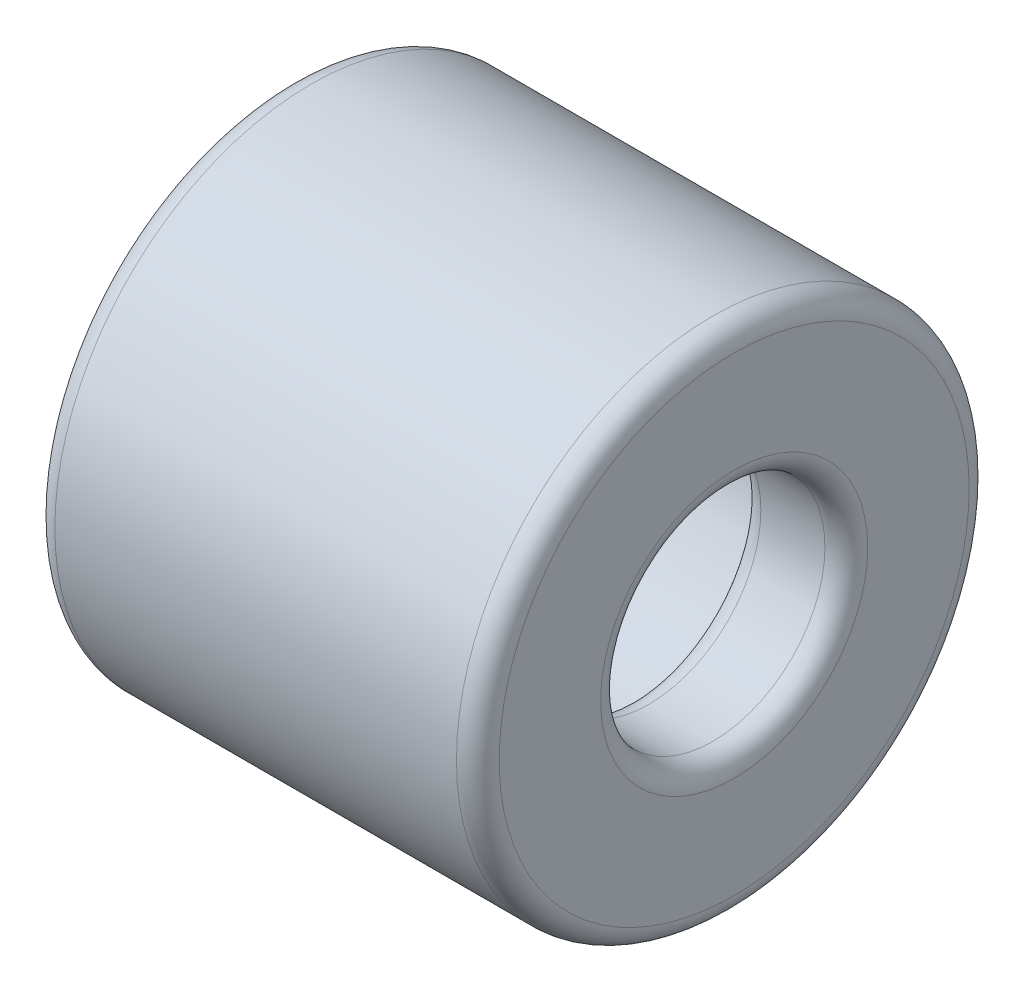
ISO-10303-21;
HEADER;
FILE_DESCRIPTION(('STEP AP214'),'2;1');
FILE_NAME('part.step','',(''),(''),'','','');
FILE_SCHEMA(('AUTOMOTIVE_DESIGN { 1 0 10303 214 1 1 1 1 }'));
ENDSEC;
DATA;
#1=APPLICATION_CONTEXT('core data for automotive mechanical design processes');
#2=APPLICATION_PROTOCOL_DEFINITION('international standard','automotive_design',2000,#1);
#3=PRODUCT_CONTEXT('',#1,'mechanical');
#4=PRODUCT('Part','Part','',(#3));
#5=PRODUCT_RELATED_PRODUCT_CATEGORY('part','',(#4));
#6=PRODUCT_DEFINITION_FORMATION('','',#4);
#7=PRODUCT_DEFINITION_CONTEXT('part definition',#1,'design');
#8=PRODUCT_DEFINITION('design','',#6,#7);
#9=PRODUCT_DEFINITION_SHAPE('','',#8);
#10=(LENGTH_UNIT() NAMED_UNIT(*) SI_UNIT(.MILLI.,.METRE.));
#11=(NAMED_UNIT(*) PLANE_ANGLE_UNIT() SI_UNIT($,.RADIAN.));
#12=(NAMED_UNIT(*) SI_UNIT($,.STERADIAN.) SOLID_ANGLE_UNIT());
#13=UNCERTAINTY_MEASURE_WITH_UNIT(LENGTH_MEASURE(1.E-05),#10,'distance_accuracy_value','');
#14=(GEOMETRIC_REPRESENTATION_CONTEXT(3) GLOBAL_UNCERTAINTY_ASSIGNED_CONTEXT((#13)) GLOBAL_UNIT_ASSIGNED_CONTEXT((#10,
#11,#12)) REPRESENTATION_CONTEXT('',''));
#15=CARTESIAN_POINT('',(0.,0.,0.));
#16=DIRECTION('',(0.,0.,1.));
#17=DIRECTION('',(1.,0.,0.));
#18=AXIS2_PLACEMENT_3D('',#15,#16,#17);
#19=CARTESIAN_POINT('',(-1.17432348671967,0.,0.));
#20=DIRECTION('',(-1.,0.,0.));
#21=DIRECTION('',(0.,0.,1.));
#22=AXIS2_PLACEMENT_3D('',#19,#20,#21);
#23=CYLINDRICAL_SURFACE('',#22,4.10000000000001);
#24=CARTESIAN_POINT('',(4.1,0.,0.));
#25=DIRECTION('',(-1.,0.,0.));
#26=DIRECTION('',(0.,0.,1.));
#27=AXIS2_PLACEMENT_3D('',#24,#25,#26);
#28=CIRCLE('',#27,4.10000000000001);
#29=CARTESIAN_POINT('',(4.1,0.,4.10000000000001));
#30=VERTEX_POINT('',#29);
#31=EDGE_CURVE('E44',#30,#30,#28,.T.);
#32=ORIENTED_EDGE('',*,*,#31,.T.);
#33=EDGE_LOOP('',(#32));
#34=FACE_BOUND('',#33,.T.);
#35=CARTESIAN_POINT('',(11.5,0.,0.));
#36=DIRECTION('',(-1.,0.,0.));
#37=DIRECTION('',(0.,0.,1.));
#38=AXIS2_PLACEMENT_3D('',#35,#36,#37);
#39=CIRCLE('',#38,4.10000000000001);
#40=CARTESIAN_POINT('',(11.5,0.,4.10000000000001));
#41=VERTEX_POINT('',#40);
#42=EDGE_CURVE('E71',#41,#41,#39,.T.);
#43=ORIENTED_EDGE('',*,*,#42,.F.);
#44=EDGE_LOOP('',(#43));
#45=FACE_BOUND('',#44,.T.);
#46=ADVANCED_FACE('F33',(#34,#45),#23,.F.);
#47=CARTESIAN_POINT('',(11.5,0.,0.));
#48=DIRECTION('',(-1.,0.,0.));
#49=DIRECTION('',(0.,0.,1.));
#50=AXIS2_PLACEMENT_3D('',#47,#48,#49);
#51=PLANE('',#50);
#52=CARTESIAN_POINT('',(11.5,0.,0.));
#53=DIRECTION('',(-1.,0.,0.));
#54=DIRECTION('',(0.,0.,1.));
#55=AXIS2_PLACEMENT_3D('',#52,#53,#54);
#56=CIRCLE('',#55,3.125);
#57=CARTESIAN_POINT('',(11.5,0.,3.125));
#58=VERTEX_POINT('',#57);
#59=EDGE_CURVE('E48',#58,#58,#56,.F.);
#60=ORIENTED_EDGE('',*,*,#59,.T.);
#61=EDGE_LOOP('',(#60));
#62=FACE_BOUND('',#61,.T.);
#63=ORIENTED_EDGE('',*,*,#42,.T.);
#64=EDGE_LOOP('',(#63));
#65=FACE_BOUND('',#64,.T.);
#66=ADVANCED_FACE('F75',(#62,#65),#51,.T.);
#67=CARTESIAN_POINT('',(14.,0.,0.));
#68=DIRECTION('',(1.,0.,0.));
#69=DIRECTION('',(0.,0.,-1.));
#70=AXIS2_PLACEMENT_3D('',#67,#68,#69);
#71=PLANE('',#70);
#72=CARTESIAN_POINT('',(14.,0.,0.));
#73=DIRECTION('',(1.,0.,0.));
#74=DIRECTION('',(0.,0.,-1.));
#75=AXIS2_PLACEMENT_3D('',#72,#73,#74);
#76=CIRCLE('',#75,5.50000000000001);
#77=CARTESIAN_POINT('',(14.,0.,-5.50000000000001));
#78=VERTEX_POINT('',#77);
#79=EDGE_CURVE('E59',#78,#78,#76,.T.);
#80=ORIENTED_EDGE('',*,*,#79,.T.);
#81=EDGE_LOOP('',(#80));
#82=FACE_BOUND('',#81,.T.);
#83=CARTESIAN_POINT('',(14.,0.,0.));
#84=DIRECTION('',(1.,0.,0.));
#85=DIRECTION('',(0.,0.,-1.));
#86=AXIS2_PLACEMENT_3D('',#83,#84,#85);
#87=CIRCLE('',#86,3.125);
#88=CARTESIAN_POINT('',(14.,0.,-3.125));
#89=VERTEX_POINT('',#88);
#90=EDGE_CURVE('E62',#89,#89,#87,.F.);
#91=ORIENTED_EDGE('',*,*,#90,.T.);
#92=EDGE_LOOP('',(#91));
#93=FACE_BOUND('',#92,.T.);
#94=ADVANCED_FACE('F83',(#82,#93),#71,.T.);
#95=CARTESIAN_POINT('',(-1.17432348671967,0.,0.));
#96=DIRECTION('',(-1.,0.,0.));
#97=DIRECTION('',(0.,0.,1.));
#98=AXIS2_PLACEMENT_3D('',#95,#96,#97);
#99=CYLINDRICAL_SURFACE('',#98,6.00000000000001);
#100=CARTESIAN_POINT('',(13.5,0.,0.));
#101=DIRECTION('',(1.,0.,0.));
#102=DIRECTION('',(0.,0.,-1.));
#103=AXIS2_PLACEMENT_3D('',#100,#101,#102);
#104=CIRCLE('',#103,6.00000000000001);
#105=CARTESIAN_POINT('',(13.5,0.,-6.00000000000001));
#106=VERTEX_POINT('',#105);
#107=EDGE_CURVE('E65',#106,#106,#104,.F.);
#108=ORIENTED_EDGE('',*,*,#107,.T.);
#109=EDGE_LOOP('',(#108));
#110=FACE_BOUND('',#109,.T.);
#111=CARTESIAN_POINT('',(4.1,0.,0.));
#112=DIRECTION('',(-1.,0.,0.));
#113=DIRECTION('',(0.,0.,1.));
#114=AXIS2_PLACEMENT_3D('',#111,#112,#113);
#115=CIRCLE('',#114,6.00000000000001);
#116=CARTESIAN_POINT('',(4.1,0.,6.00000000000001));
#117=VERTEX_POINT('',#116);
#118=EDGE_CURVE('E68',#117,#117,#115,.F.);
#119=ORIENTED_EDGE('',*,*,#118,.T.);
#120=EDGE_LOOP('',(#119));
#121=FACE_BOUND('',#120,.T.);
#122=ADVANCED_FACE('F114',(#110,#121),#99,.T.);
#123=CARTESIAN_POINT('',(3.6,0.,0.));
#124=DIRECTION('',(-1.,0.,0.));
#125=DIRECTION('',(0.,0.,1.));
#126=AXIS2_PLACEMENT_3D('',#123,#124,#125);
#127=PLANE('',#126);
#128=CARTESIAN_POINT('',(3.6,0.,0.));
#129=DIRECTION('',(-1.,0.,0.));
#130=DIRECTION('',(0.,0.,1.));
#131=AXIS2_PLACEMENT_3D('',#128,#129,#130);
#132=CIRCLE('',#131,4.60000000000001);
#133=CARTESIAN_POINT('',(3.6,0.,4.60000000000001));
#134=VERTEX_POINT('',#133);
#135=EDGE_CURVE('E10',#134,#134,#132,.F.);
#136=ORIENTED_EDGE('',*,*,#135,.T.);
#137=EDGE_LOOP('',(#136));
#138=FACE_BOUND('',#137,.T.);
#139=CARTESIAN_POINT('',(3.6,0.,0.));
#140=DIRECTION('',(-1.,0.,0.));
#141=DIRECTION('',(0.,0.,1.));
#142=AXIS2_PLACEMENT_3D('',#139,#140,#141);
#143=CIRCLE('',#142,5.50000000000001);
#144=CARTESIAN_POINT('',(3.6,0.,5.50000000000001));
#145=VERTEX_POINT('',#144);
#146=EDGE_CURVE('E40',#145,#145,#143,.T.);
#147=ORIENTED_EDGE('',*,*,#146,.T.);
#148=EDGE_LOOP('',(#147));
#149=FACE_BOUND('',#148,.T.);
#150=ADVANCED_FACE('F116',(#138,#149),#127,.T.);
#151=CARTESIAN_POINT('',(3.6,0.,0.));
#152=DIRECTION('',(-1.,0.,0.));
#153=DIRECTION('',(0.,0.,1.));
#154=AXIS2_PLACEMENT_3D('',#151,#152,#153);
#155=CYLINDRICAL_SURFACE('',#154,2.625);
#156=CARTESIAN_POINT('',(13.5,0.,0.));
#157=DIRECTION('',(1.,0.,0.));
#158=DIRECTION('',(0.,0.,-1.));
#159=AXIS2_PLACEMENT_3D('',#156,#157,#158);
#160=CIRCLE('',#159,2.625);
#161=CARTESIAN_POINT('',(13.5,0.,-2.625));
#162=VERTEX_POINT('',#161);
#163=EDGE_CURVE('E53',#162,#162,#160,.T.);
#164=ORIENTED_EDGE('',*,*,#163,.T.);
#165=EDGE_LOOP('',(#164));
#166=FACE_BOUND('',#165,.T.);
#167=CARTESIAN_POINT('',(12.,0.,0.));
#168=DIRECTION('',(-1.,0.,0.));
#169=DIRECTION('',(0.,0.,1.));
#170=AXIS2_PLACEMENT_3D('',#167,#168,#169);
#171=CIRCLE('',#170,2.625);
#172=CARTESIAN_POINT('',(12.,0.,2.625));
#173=VERTEX_POINT('',#172);
#174=EDGE_CURVE('E56',#173,#173,#171,.T.);
#175=ORIENTED_EDGE('',*,*,#174,.T.);
#176=EDGE_LOOP('',(#175));
#177=FACE_BOUND('',#176,.T.);
#178=ADVANCED_FACE('F92',(#166,#177),#155,.F.);
#179=CARTESIAN_POINT('',(13.5,0.,0.));
#180=DIRECTION('',(1.,0.,0.));
#181=DIRECTION('',(0.,0.,-1.));
#182=AXIS2_PLACEMENT_3D('',#179,#180,#181);
#183=TOROIDAL_SURFACE('',#182,5.50000000000001,0.5);
#184=ORIENTED_EDGE('',*,*,#79,.F.);
#185=EDGE_LOOP('',(#184));
#186=FACE_BOUND('',#185,.T.);
#187=ORIENTED_EDGE('',*,*,#107,.F.);
#188=EDGE_LOOP('',(#187));
#189=FACE_BOUND('',#188,.T.);
#190=ADVANCED_FACE('F88',(#186,#189),#183,.T.);
#191=CARTESIAN_POINT('',(13.5,0.,0.));
#192=DIRECTION('',(1.,0.,0.));
#193=DIRECTION('',(0.,0.,-1.));
#194=AXIS2_PLACEMENT_3D('',#191,#192,#193);
#195=TOROIDAL_SURFACE('',#194,3.125,0.5);
#196=ORIENTED_EDGE('',*,*,#90,.F.);
#197=EDGE_LOOP('',(#196));
#198=FACE_BOUND('',#197,.T.);
#199=ORIENTED_EDGE('',*,*,#163,.F.);
#200=EDGE_LOOP('',(#199));
#201=FACE_BOUND('',#200,.T.);
#202=ADVANCED_FACE('F91',(#198,#201),#195,.T.);
#203=CARTESIAN_POINT('',(12.,0.,0.));
#204=DIRECTION('',(-1.,0.,0.));
#205=DIRECTION('',(0.,0.,1.));
#206=AXIS2_PLACEMENT_3D('',#203,#204,#205);
#207=TOROIDAL_SURFACE('',#206,3.125,0.5);
#208=ORIENTED_EDGE('',*,*,#174,.F.);
#209=EDGE_LOOP('',(#208));
#210=FACE_BOUND('',#209,.T.);
#211=ORIENTED_EDGE('',*,*,#59,.F.);
#212=EDGE_LOOP('',(#211));
#213=FACE_BOUND('',#212,.T.);
#214=ADVANCED_FACE('F96',(#210,#213),#207,.T.);
#215=CARTESIAN_POINT('',(4.1,0.,0.));
#216=DIRECTION('',(-1.,0.,0.));
#217=DIRECTION('',(0.,0.,1.));
#218=AXIS2_PLACEMENT_3D('',#215,#216,#217);
#219=TOROIDAL_SURFACE('',#218,4.60000000000001,0.5);
#220=ORIENTED_EDGE('',*,*,#135,.F.);
#221=EDGE_LOOP('',(#220));
#222=FACE_BOUND('',#221,.T.);
#223=ORIENTED_EDGE('',*,*,#31,.F.);
#224=EDGE_LOOP('',(#223));
#225=FACE_BOUND('',#224,.T.);
#226=ADVANCED_FACE('F99',(#222,#225),#219,.T.);
#227=CARTESIAN_POINT('',(4.1,0.,0.));
#228=DIRECTION('',(-1.,0.,0.));
#229=DIRECTION('',(0.,0.,1.));
#230=AXIS2_PLACEMENT_3D('',#227,#228,#229);
#231=TOROIDAL_SURFACE('',#230,5.50000000000001,0.5);
#232=ORIENTED_EDGE('',*,*,#118,.F.);
#233=EDGE_LOOP('',(#232));
#234=FACE_BOUND('',#233,.T.);
#235=ORIENTED_EDGE('',*,*,#146,.F.);
#236=EDGE_LOOP('',(#235));
#237=FACE_BOUND('',#236,.T.);
#238=ADVANCED_FACE('F35',(#234,#237),#231,.T.);
#239=CLOSED_SHELL('',(#46,#66,#94,#122,#150,#178,#190,#202,#214,#226,#238));
#240=MANIFOLD_SOLID_BREP('B2',#239);
#241=ADVANCED_BREP_SHAPE_REPRESENTATION('',(#18,#240),#14);
#242=SHAPE_DEFINITION_REPRESENTATION(#9,#241);
ENDSEC;
END-ISO-10303-21;
